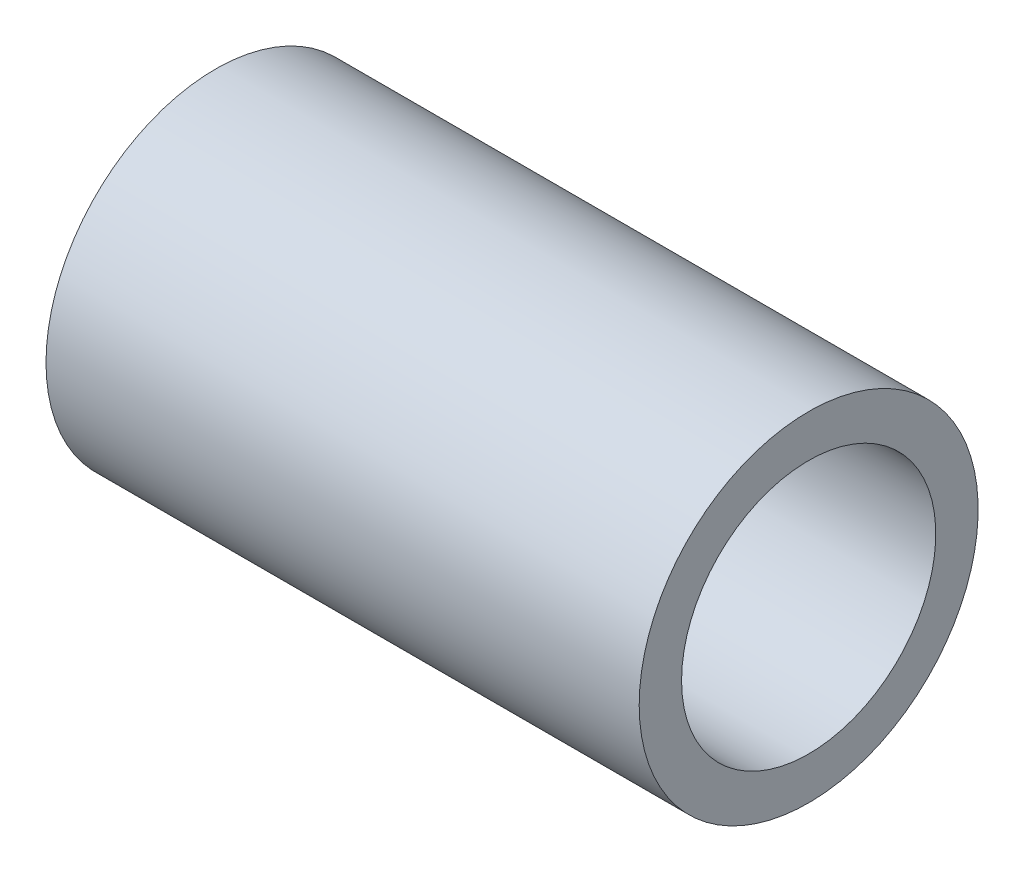
ISO-10303-21;
HEADER;
FILE_DESCRIPTION(('STEP AP214'),'2;1');
FILE_NAME('part.step','',(''),(''),'','','');
FILE_SCHEMA(('AUTOMOTIVE_DESIGN { 1 0 10303 214 1 1 1 1 }'));
ENDSEC;
DATA;
#1=APPLICATION_CONTEXT('core data for automotive mechanical design processes');
#2=APPLICATION_PROTOCOL_DEFINITION('international standard','automotive_design',2000,#1);
#3=PRODUCT_CONTEXT('',#1,'mechanical');
#4=PRODUCT('Part','Part','',(#3));
#5=PRODUCT_RELATED_PRODUCT_CATEGORY('part','',(#4));
#6=PRODUCT_DEFINITION_FORMATION('','',#4);
#7=PRODUCT_DEFINITION_CONTEXT('part definition',#1,'design');
#8=PRODUCT_DEFINITION('design','',#6,#7);
#9=PRODUCT_DEFINITION_SHAPE('','',#8);
#10=(LENGTH_UNIT() NAMED_UNIT(*) SI_UNIT(.MILLI.,.METRE.));
#11=(NAMED_UNIT(*) PLANE_ANGLE_UNIT() SI_UNIT($,.RADIAN.));
#12=(NAMED_UNIT(*) SI_UNIT($,.STERADIAN.) SOLID_ANGLE_UNIT());
#13=UNCERTAINTY_MEASURE_WITH_UNIT(LENGTH_MEASURE(1.E-05),#10,'distance_accuracy_value','');
#14=(GEOMETRIC_REPRESENTATION_CONTEXT(3) GLOBAL_UNCERTAINTY_ASSIGNED_CONTEXT((#13)) GLOBAL_UNIT_ASSIGNED_CONTEXT((#10,
#11,#12)) REPRESENTATION_CONTEXT('',''));
#15=CARTESIAN_POINT('',(0.,0.,0.));
#16=DIRECTION('',(0.,0.,1.));
#17=DIRECTION('',(1.,0.,0.));
#18=AXIS2_PLACEMENT_3D('',#15,#16,#17);
#19=CARTESIAN_POINT('',(-3.5,2.,0.));
#20=DIRECTION('',(1.,0.,0.));
#21=DIRECTION('',(0.,0.,-1.));
#22=AXIS2_PLACEMENT_3D('',#19,#20,#21);
#23=PLANE('',#22);
#24=CARTESIAN_POINT('',(-3.5,0.,0.));
#25=DIRECTION('',(-1.,0.,0.));
#26=DIRECTION('',(0.,0.,1.));
#27=AXIS2_PLACEMENT_3D('',#24,#25,#26);
#28=CIRCLE('',#27,1.5);
#29=CARTESIAN_POINT('',(-3.5,0.,1.5));
#30=VERTEX_POINT('',#29);
#31=EDGE_CURVE('E10',#30,#30,#28,.T.);
#32=ORIENTED_EDGE('',*,*,#31,.F.);
#33=EDGE_LOOP('',(#32));
#34=FACE_BOUND('',#33,.T.);
#35=CARTESIAN_POINT('',(-3.5,0.,0.));
#36=DIRECTION('',(-1.,0.,0.));
#37=DIRECTION('',(0.,0.,1.));
#38=AXIS2_PLACEMENT_3D('',#35,#36,#37);
#39=CIRCLE('',#38,2.);
#40=CARTESIAN_POINT('',(-3.5,0.,2.));
#41=VERTEX_POINT('',#40);
#42=EDGE_CURVE('E48',#41,#41,#39,.T.);
#43=ORIENTED_EDGE('',*,*,#42,.T.);
#44=EDGE_LOOP('',(#43));
#45=FACE_BOUND('',#44,.T.);
#46=ADVANCED_FACE('F34',(#34,#45),#23,.F.);
#47=CARTESIAN_POINT('',(-0.962623157134353,0.,0.));
#48=DIRECTION('',(-1.,0.,0.));
#49=DIRECTION('',(0.,0.,1.));
#50=AXIS2_PLACEMENT_3D('',#47,#48,#49);
#51=CYLINDRICAL_SURFACE('',#50,1.5);
#52=CARTESIAN_POINT('',(3.5,0.,0.));
#53=DIRECTION('',(-1.,0.,0.));
#54=DIRECTION('',(0.,0.,1.));
#55=AXIS2_PLACEMENT_3D('',#52,#53,#54);
#56=CIRCLE('',#55,1.5);
#57=CARTESIAN_POINT('',(3.5,0.,1.5));
#58=VERTEX_POINT('',#57);
#59=EDGE_CURVE('E40',#58,#58,#56,.T.);
#60=ORIENTED_EDGE('',*,*,#59,.F.);
#61=EDGE_LOOP('',(#60));
#62=FACE_BOUND('',#61,.T.);
#63=ORIENTED_EDGE('',*,*,#31,.T.);
#64=EDGE_LOOP('',(#63));
#65=FACE_BOUND('',#64,.T.);
#66=ADVANCED_FACE('F63',(#62,#65),#51,.F.);
#67=CARTESIAN_POINT('',(3.5,2.,0.));
#68=DIRECTION('',(-1.,0.,0.));
#69=DIRECTION('',(0.,0.,1.));
#70=AXIS2_PLACEMENT_3D('',#67,#68,#69);
#71=PLANE('',#70);
#72=CARTESIAN_POINT('',(3.5,0.,0.));
#73=DIRECTION('',(-1.,0.,0.));
#74=DIRECTION('',(0.,0.,1.));
#75=AXIS2_PLACEMENT_3D('',#72,#73,#74);
#76=CIRCLE('',#75,2.);
#77=CARTESIAN_POINT('',(3.5,0.,2.));
#78=VERTEX_POINT('',#77);
#79=EDGE_CURVE('E44',#78,#78,#76,.T.);
#80=ORIENTED_EDGE('',*,*,#79,.F.);
#81=EDGE_LOOP('',(#80));
#82=FACE_BOUND('',#81,.T.);
#83=ORIENTED_EDGE('',*,*,#59,.T.);
#84=EDGE_LOOP('',(#83));
#85=FACE_BOUND('',#84,.T.);
#86=ADVANCED_FACE('F58',(#82,#85),#71,.F.);
#87=CARTESIAN_POINT('',(-0.962623157134353,0.,0.));
#88=DIRECTION('',(-1.,0.,0.));
#89=DIRECTION('',(0.,0.,1.));
#90=AXIS2_PLACEMENT_3D('',#87,#88,#89);
#91=CYLINDRICAL_SURFACE('',#90,2.);
#92=ORIENTED_EDGE('',*,*,#42,.F.);
#93=EDGE_LOOP('',(#92));
#94=FACE_BOUND('',#93,.T.);
#95=ORIENTED_EDGE('',*,*,#79,.T.);
#96=EDGE_LOOP('',(#95));
#97=FACE_BOUND('',#96,.T.);
#98=ADVANCED_FACE('F55',(#94,#97),#91,.T.);
#99=CLOSED_SHELL('',(#46,#66,#86,#98));
#100=MANIFOLD_SOLID_BREP('B2',#99);
#101=ADVANCED_BREP_SHAPE_REPRESENTATION('',(#18,#100),#14);
#102=SHAPE_DEFINITION_REPRESENTATION(#9,#101);
ENDSEC;
END-ISO-10303-21;
